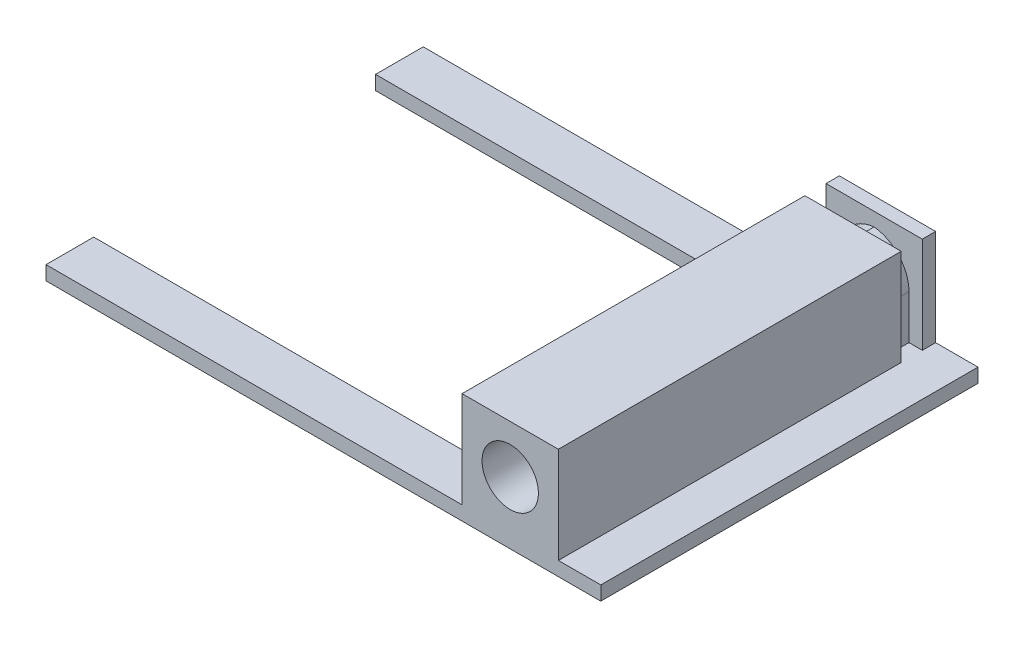
ISO-10303-21;
HEADER;
FILE_DESCRIPTION(('STEP AP214'),'2;1');
FILE_NAME('part.step','',(''),(''),'','','');
FILE_SCHEMA(('AUTOMOTIVE_DESIGN { 1 0 10303 214 1 1 1 1 }'));
ENDSEC;
DATA;
#1=APPLICATION_CONTEXT('core data for automotive mechanical design processes');
#2=APPLICATION_PROTOCOL_DEFINITION('international standard','automotive_design',2000,#1);
#3=PRODUCT_CONTEXT('',#1,'mechanical');
#4=PRODUCT('Part','Part','',(#3));
#5=PRODUCT_RELATED_PRODUCT_CATEGORY('part','',(#4));
#6=PRODUCT_DEFINITION_FORMATION('','',#4);
#7=PRODUCT_DEFINITION_CONTEXT('part definition',#1,'design');
#8=PRODUCT_DEFINITION('design','',#6,#7);
#9=PRODUCT_DEFINITION_SHAPE('','',#8);
#10=(LENGTH_UNIT() NAMED_UNIT(*) SI_UNIT(.MILLI.,.METRE.));
#11=(NAMED_UNIT(*) PLANE_ANGLE_UNIT() SI_UNIT($,.RADIAN.));
#12=(NAMED_UNIT(*) SI_UNIT($,.STERADIAN.) SOLID_ANGLE_UNIT());
#13=UNCERTAINTY_MEASURE_WITH_UNIT(LENGTH_MEASURE(1.E-05),#10,'distance_accuracy_value','');
#14=(GEOMETRIC_REPRESENTATION_CONTEXT(3) GLOBAL_UNCERTAINTY_ASSIGNED_CONTEXT((#13)) GLOBAL_UNIT_ASSIGNED_CONTEXT((#10,
#11,#12)) REPRESENTATION_CONTEXT('',''));
#15=CARTESIAN_POINT('',(0.,0.,0.));
#16=DIRECTION('',(0.,0.,1.));
#17=DIRECTION('',(1.,0.,0.));
#18=AXIS2_PLACEMENT_3D('',#15,#16,#17);
#19=CARTESIAN_POINT('',(94.053788038545,12.7,-196.825353899226));
#20=DIRECTION('',(1.,0.,0.));
#21=DIRECTION('',(0.,0.,-1.));
#22=AXIS2_PLACEMENT_3D('',#19,#20,#21);
#23=PLANE('',#22);
#24=DIRECTION('',(0.,1.,0.));
#25=VECTOR('',#24,1.);
#26=CARTESIAN_POINT('',(94.053788038545,87.5,-184.825353899226));
#27=LINE('',#26,#25);
#28=CARTESIAN_POINT('',(94.053788038545,12.7,-184.825353899226));
#29=VERTEX_POINT('',#28);
#30=CARTESIAN_POINT('',(94.053788038545,99.5,-184.825353899226));
#31=VERTEX_POINT('',#30);
#32=EDGE_CURVE('E238',#29,#31,#27,.T.);
#33=ORIENTED_EDGE('',*,*,#32,.F.);
#34=DIRECTION('',(0.,0.,1.));
#35=VECTOR('',#34,1.);
#36=CARTESIAN_POINT('',(94.053788038545,12.7,-196.825353899226));
#37=LINE('',#36,#35);
#38=CARTESIAN_POINT('',(94.053788038545,12.7,-196.825353899226));
#39=VERTEX_POINT('',#38);
#40=EDGE_CURVE('E293',#39,#29,#37,.T.);
#41=ORIENTED_EDGE('',*,*,#40,.F.);
#42=DIRECTION('',(0.,1.,0.));
#43=VECTOR('',#42,1.);
#44=CARTESIAN_POINT('',(94.053788038545,12.7,-196.825353899226));
#45=LINE('',#44,#43);
#46=CARTESIAN_POINT('',(94.053788038545,99.5000000000001,-196.825353899226));
#47=VERTEX_POINT('',#46);
#48=EDGE_CURVE('E262',#39,#47,#45,.T.);
#49=ORIENTED_EDGE('',*,*,#48,.T.);
#50=DIRECTION('',(0.,0.,1.));
#51=VECTOR('',#50,1.);
#52=CARTESIAN_POINT('',(94.053788038545,99.5000000000001,-196.825353899226));
#53=LINE('',#52,#51);
#54=EDGE_CURVE('E288',#47,#31,#53,.T.);
#55=ORIENTED_EDGE('',*,*,#54,.T.);
#56=EDGE_LOOP('',(#33,#41,#49,#55));
#57=FACE_BOUND('',#56,.T.);
#58=ADVANCED_FACE('F39',(#57),#23,.T.);
#59=CARTESIAN_POINT('',(7.253788038545,12.7,-153.825353899226));
#60=DIRECTION('',(1.,0.,0.));
#61=DIRECTION('',(0.,0.,-1.));
#62=AXIS2_PLACEMENT_3D('',#59,#60,#61);
#63=PLANE('',#62);
#64=DIRECTION('',(0.,1.,0.));
#65=VECTOR('',#64,1.);
#66=CARTESIAN_POINT('',(7.25378803854504,87.5,-165.825353899226));
#67=LINE('',#66,#65);
#68=CARTESIAN_POINT('',(7.25378803854499,12.7,-165.825353899226));
#69=VERTEX_POINT('',#68);
#70=CARTESIAN_POINT('',(7.25378803854504,99.5,-165.825353899226));
#71=VERTEX_POINT('',#70);
#72=EDGE_CURVE('E242',#69,#71,#67,.T.);
#73=ORIENTED_EDGE('',*,*,#72,.F.);
#74=DIRECTION('',(0.,0.,1.));
#75=VECTOR('',#74,1.);
#76=CARTESIAN_POINT('',(7.25378803854504,12.7,-196.825353899226));
#77=LINE('',#76,#75);
#78=CARTESIAN_POINT('',(7.25378803854504,12.7,-153.825353899226));
#79=VERTEX_POINT('',#78);
#80=EDGE_CURVE('E271',#69,#79,#77,.T.);
#81=ORIENTED_EDGE('',*,*,#80,.T.);
#82=DIRECTION('',(0.,-1.,0.));
#83=VECTOR('',#82,1.);
#84=CARTESIAN_POINT('',(7.253788038545,12.7,-153.825353899226));
#85=LINE('',#84,#83);
#86=CARTESIAN_POINT('',(7.253788038545,0.,-153.825353899226));
#87=VERTEX_POINT('',#86);
#88=EDGE_CURVE('E331',#79,#87,#85,.T.);
#89=ORIENTED_EDGE('',*,*,#88,.T.);
#90=DIRECTION('',(0.,0.,1.));
#91=VECTOR('',#90,1.);
#92=CARTESIAN_POINT('',(7.253788038545,0.,-153.825353899226));
#93=LINE('',#92,#91);
#94=CARTESIAN_POINT('',(7.25378803854503,0.,100.174646100774));
#95=VERTEX_POINT('',#94);
#96=EDGE_CURVE('E286',#87,#95,#93,.T.);
#97=ORIENTED_EDGE('',*,*,#96,.T.);
#98=DIRECTION('',(0.,-1.,0.));
#99=VECTOR('',#98,1.);
#100=CARTESIAN_POINT('',(7.25378803854503,12.7,100.174646100774));
#101=LINE('',#100,#99);
#102=CARTESIAN_POINT('',(7.25378803854504,12.7,100.174646100774));
#103=VERTEX_POINT('',#102);
#104=EDGE_CURVE('E382',#103,#95,#101,.T.);
#105=ORIENTED_EDGE('',*,*,#104,.F.);
#106=CARTESIAN_POINT('',(7.25378803854504,12.7,143.174646100774));
#107=VERTEX_POINT('',#106);
#108=EDGE_CURVE('E301',#103,#107,#77,.T.);
#109=ORIENTED_EDGE('',*,*,#108,.T.);
#110=DIRECTION('',(0.,-1.,0.));
#111=VECTOR('',#110,1.);
#112=CARTESIAN_POINT('',(7.25378803854504,12.7,143.174646100774));
#113=LINE('',#112,#111);
#114=CARTESIAN_POINT('',(7.25378803854504,99.5,143.174646100774));
#115=VERTEX_POINT('',#114);
#116=EDGE_CURVE('E255',#115,#107,#113,.T.);
#117=ORIENTED_EDGE('',*,*,#116,.F.);
#118=DIRECTION('',(0.,0.,1.));
#119=VECTOR('',#118,1.);
#120=CARTESIAN_POINT('',(7.25378803854504,99.5,-196.825353899226));
#121=LINE('',#120,#119);
#122=EDGE_CURVE('E287',#71,#115,#121,.T.);
#123=ORIENTED_EDGE('',*,*,#122,.F.);
#124=EDGE_LOOP('',(#73,#81,#89,#97,#105,#109,#117,#123));
#125=FACE_BOUND('',#124,.T.);
#126=ADVANCED_FACE('F407',(#125),#63,.F.);
#127=CARTESIAN_POINT('',(7.25378803854504,99.5,-196.825353899226));
#128=DIRECTION('',(0.,1.,0.));
#129=DIRECTION('',(-1.,0.,0.));
#130=AXIS2_PLACEMENT_3D('',#127,#128,#129);
#131=PLANE('',#130);
#132=DIRECTION('',(1.,0.,0.));
#133=VECTOR('',#132,1.);
#134=CARTESIAN_POINT('',(7.25378803854504,99.5,-165.825353899226));
#135=LINE('',#134,#133);
#136=CARTESIAN_POINT('',(94.053788038545,99.5,-165.825353899226));
#137=VERTEX_POINT('',#136);
#138=EDGE_CURVE('E235',#71,#137,#135,.T.);
#139=ORIENTED_EDGE('',*,*,#138,.F.);
#140=ORIENTED_EDGE('',*,*,#122,.T.);
#141=DIRECTION('',(-1.,0.,0.));
#142=VECTOR('',#141,1.);
#143=CARTESIAN_POINT('',(7.25378803854504,99.5,143.174646100774));
#144=LINE('',#143,#142);
#145=CARTESIAN_POINT('',(94.053788038545,99.5000000000001,143.174646100774));
#146=VERTEX_POINT('',#145);
#147=EDGE_CURVE('E263',#146,#115,#144,.T.);
#148=ORIENTED_EDGE('',*,*,#147,.F.);
#149=EDGE_CURVE('E292',#137,#146,#53,.T.);
#150=ORIENTED_EDGE('',*,*,#149,.F.);
#151=EDGE_LOOP('',(#139,#140,#148,#150));
#152=FACE_BOUND('',#151,.T.);
#153=ADVANCED_FACE('F445',(#152),#131,.T.);
#154=CARTESIAN_POINT('',(0.,12.7,0.));
#155=DIRECTION('',(0.,-1.,0.));
#156=DIRECTION('',(0.,0.,-1.));
#157=AXIS2_PLACEMENT_3D('',#154,#155,#156);
#158=PLANE('',#157);
#159=CARTESIAN_POINT('',(7.25378803854504,12.7,-196.825353899226));
#160=VERTEX_POINT('',#159);
#161=CARTESIAN_POINT('',(7.25378803854499,12.7,-184.825353899226));
#162=VERTEX_POINT('',#161);
#163=EDGE_CURVE('E297',#160,#162,#77,.T.);
#164=ORIENTED_EDGE('',*,*,#163,.F.);
#165=DIRECTION('',(1.,0.,0.));
#166=VECTOR('',#165,1.);
#167=CARTESIAN_POINT('',(-367.746211961455,12.7,-196.825353899226));
#168=LINE('',#167,#166);
#169=CARTESIAN_POINT('',(-367.746211961455,12.7,-196.825353899226));
#170=VERTEX_POINT('',#169);
#171=EDGE_CURVE('E320',#170,#160,#168,.T.);
#172=ORIENTED_EDGE('',*,*,#171,.F.);
#173=DIRECTION('',(0.,0.,1.));
#174=VECTOR('',#173,1.);
#175=CARTESIAN_POINT('',(-367.746211961455,12.7,-196.825353899226));
#176=LINE('',#175,#174);
#177=CARTESIAN_POINT('',(-367.746211961455,12.7,-153.825353899226));
#178=VERTEX_POINT('',#177);
#179=EDGE_CURVE('E324',#170,#178,#176,.T.);
#180=ORIENTED_EDGE('',*,*,#179,.T.);
#181=DIRECTION('',(1.,0.,0.));
#182=VECTOR('',#181,1.);
#183=CARTESIAN_POINT('',(-367.746211961455,12.7,-153.825353899226));
#184=LINE('',#183,#182);
#185=EDGE_CURVE('E327',#178,#79,#184,.T.);
#186=ORIENTED_EDGE('',*,*,#185,.T.);
#187=ORIENTED_EDGE('',*,*,#80,.F.);
#188=DIRECTION('',(-1.,0.,0.));
#189=VECTOR('',#188,1.);
#190=CARTESIAN_POINT('',(19.253788038545,12.7,-165.825353899226));
#191=LINE('',#190,#189);
#192=CARTESIAN_POINT('',(19.253788038545,12.7,-165.825353899226));
#193=VERTEX_POINT('',#192);
#194=EDGE_CURVE('E228',#193,#69,#191,.T.);
#195=ORIENTED_EDGE('',*,*,#194,.F.);
#196=DIRECTION('',(0.,0.,1.));
#197=VECTOR('',#196,1.);
#198=CARTESIAN_POINT('',(19.253788038545,12.7,-184.825353899226));
#199=LINE('',#198,#197);
#200=CARTESIAN_POINT('',(19.253788038545,12.7,-184.825353899226));
#201=VERTEX_POINT('',#200);
#202=EDGE_CURVE('E217',#201,#193,#199,.T.);
#203=ORIENTED_EDGE('',*,*,#202,.F.);
#204=DIRECTION('',(-1.,0.,0.));
#205=VECTOR('',#204,1.);
#206=CARTESIAN_POINT('',(19.253788038545,12.7,-184.825353899226));
#207=LINE('',#206,#205);
#208=EDGE_CURVE('E224',#201,#162,#207,.T.);
#209=ORIENTED_EDGE('',*,*,#208,.T.);
#210=EDGE_LOOP('',(#164,#172,#180,#186,#187,#195,#203,#209));
#211=FACE_BOUND('',#210,.T.);
#212=ADVANCED_FACE('F415',(#211),#158,.F.);
#213=ORIENTED_EDGE('',*,*,#108,.F.);
#214=DIRECTION('',(-1.,0.,0.));
#215=VECTOR('',#214,1.);
#216=CARTESIAN_POINT('',(7.25378803854503,12.7,100.174646100774));
#217=LINE('',#216,#215);
#218=CARTESIAN_POINT('',(-367.746211961455,12.7,100.174646100774));
#219=VERTEX_POINT('',#218);
#220=EDGE_CURVE('E302',#103,#219,#217,.T.);
#221=ORIENTED_EDGE('',*,*,#220,.T.);
#222=DIRECTION('',(0.,0.,1.));
#223=VECTOR('',#222,1.);
#224=CARTESIAN_POINT('',(-367.746211961455,12.7,100.174646100774));
#225=LINE('',#224,#223);
#226=CARTESIAN_POINT('',(-367.746211961455,12.7,143.174646100774));
#227=VERTEX_POINT('',#226);
#228=EDGE_CURVE('E305',#219,#227,#225,.T.);
#229=ORIENTED_EDGE('',*,*,#228,.T.);
#230=DIRECTION('',(-1.,0.,0.));
#231=VECTOR('',#230,1.);
#232=CARTESIAN_POINT('',(132.253788038545,12.7,143.174646100774));
#233=LINE('',#232,#231);
#234=EDGE_CURVE('E310',#107,#227,#233,.T.);
#235=ORIENTED_EDGE('',*,*,#234,.F.);
#236=EDGE_LOOP('',(#213,#221,#229,#235));
#237=FACE_BOUND('',#236,.T.);
#238=ADVANCED_FACE('F435',(#237),#158,.F.);
#239=ORIENTED_EDGE('',*,*,#163,.T.);
#240=DIRECTION('',(0.,1.,0.));
#241=VECTOR('',#240,1.);
#242=CARTESIAN_POINT('',(7.25378803854504,87.5,-184.825353899226));
#243=LINE('',#242,#241);
#244=CARTESIAN_POINT('',(7.25378803854504,99.5,-184.825353899226));
#245=VERTEX_POINT('',#244);
#246=EDGE_CURVE('E245',#162,#245,#243,.T.);
#247=ORIENTED_EDGE('',*,*,#246,.T.);
#248=CARTESIAN_POINT('',(7.25378803854504,99.5,-196.825353899226));
#249=VERTEX_POINT('',#248);
#250=EDGE_CURVE('E282',#249,#245,#121,.T.);
#251=ORIENTED_EDGE('',*,*,#250,.F.);
#252=DIRECTION('',(0.,-1.,0.));
#253=VECTOR('',#252,1.);
#254=CARTESIAN_POINT('',(7.25378803854504,12.7,-196.825353899226));
#255=LINE('',#254,#253);
#256=EDGE_CURVE('E259',#249,#160,#255,.T.);
#257=ORIENTED_EDGE('',*,*,#256,.T.);
#258=EDGE_LOOP('',(#239,#247,#251,#257));
#259=FACE_BOUND('',#258,.T.);
#260=ADVANCED_FACE('F485',(#259),#63,.F.);
#261=CARTESIAN_POINT('',(7.25378803854503,12.7,100.174646100774));
#262=DIRECTION('',(0.,0.,1.));
#263=DIRECTION('',(1.,0.,0.));
#264=AXIS2_PLACEMENT_3D('',#261,#262,#263);
#265=PLANE('',#264);
#266=DIRECTION('',(-1.,0.,0.));
#267=VECTOR('',#266,1.);
#268=CARTESIAN_POINT('',(7.25378803854503,0.,100.174646100774));
#269=LINE('',#268,#267);
#270=CARTESIAN_POINT('',(-367.746211961455,0.,100.174646100774));
#271=VERTEX_POINT('',#270);
#272=EDGE_CURVE('E335',#95,#271,#269,.T.);
#273=ORIENTED_EDGE('',*,*,#272,.T.);
#274=DIRECTION('',(0.,-1.,0.));
#275=VECTOR('',#274,1.);
#276=CARTESIAN_POINT('',(-367.746211961455,12.7,100.174646100774));
#277=LINE('',#276,#275);
#278=EDGE_CURVE('E378',#219,#271,#277,.T.);
#279=ORIENTED_EDGE('',*,*,#278,.F.);
#280=ORIENTED_EDGE('',*,*,#220,.F.);
#281=ORIENTED_EDGE('',*,*,#104,.T.);
#282=EDGE_LOOP('',(#273,#279,#280,#281));
#283=FACE_BOUND('',#282,.T.);
#284=ADVANCED_FACE('F431',(#283),#265,.F.);
#285=CARTESIAN_POINT('',(-367.746211961455,12.7,100.174646100774));
#286=DIRECTION('',(1.,0.,0.));
#287=DIRECTION('',(0.,0.,-1.));
#288=AXIS2_PLACEMENT_3D('',#285,#286,#287);
#289=PLANE('',#288);
#290=DIRECTION('',(0.,0.,1.));
#291=VECTOR('',#290,1.);
#292=CARTESIAN_POINT('',(-367.746211961455,0.,100.174646100774));
#293=LINE('',#292,#291);
#294=CARTESIAN_POINT('',(-367.746211961455,0.,143.174646100774));
#295=VERTEX_POINT('',#294);
#296=EDGE_CURVE('E338',#271,#295,#293,.T.);
#297=ORIENTED_EDGE('',*,*,#296,.T.);
#298=DIRECTION('',(0.,-1.,0.));
#299=VECTOR('',#298,1.);
#300=CARTESIAN_POINT('',(-367.746211961455,12.7,143.174646100774));
#301=LINE('',#300,#299);
#302=EDGE_CURVE('E375',#227,#295,#301,.T.);
#303=ORIENTED_EDGE('',*,*,#302,.F.);
#304=ORIENTED_EDGE('',*,*,#228,.F.);
#305=ORIENTED_EDGE('',*,*,#278,.T.);
#306=EDGE_LOOP('',(#297,#303,#304,#305));
#307=FACE_BOUND('',#306,.T.);
#308=ADVANCED_FACE('F527',(#307),#289,.F.);
#309=CARTESIAN_POINT('',(132.253788038545,12.7,143.174646100774));
#310=DIRECTION('',(0.,0.,1.));
#311=DIRECTION('',(1.,0.,0.));
#312=AXIS2_PLACEMENT_3D('',#309,#310,#311);
#313=PLANE('',#312);
#314=DIRECTION('',(-1.,0.,0.));
#315=VECTOR('',#314,1.);
#316=CARTESIAN_POINT('',(132.253788038545,0.,143.174646100774));
#317=LINE('',#316,#315);
#318=CARTESIAN_POINT('',(132.253788038545,0.,143.174646100774));
#319=VERTEX_POINT('',#318);
#320=EDGE_CURVE('E342',#319,#295,#317,.T.);
#321=ORIENTED_EDGE('',*,*,#320,.F.);
#322=DIRECTION('',(0.,-1.,0.));
#323=VECTOR('',#322,1.);
#324=CARTESIAN_POINT('',(132.253788038545,12.7,143.174646100774));
#325=LINE('',#324,#323);
#326=CARTESIAN_POINT('',(132.253788038545,12.7,143.174646100774));
#327=VERTEX_POINT('',#326);
#328=EDGE_CURVE('E372',#327,#319,#325,.T.);
#329=ORIENTED_EDGE('',*,*,#328,.F.);
#330=CARTESIAN_POINT('',(94.053788038545,12.7,143.174646100774));
#331=VERTEX_POINT('',#330);
#332=EDGE_CURVE('E311',#327,#331,#233,.T.);
#333=ORIENTED_EDGE('',*,*,#332,.T.);
#334=DIRECTION('',(0.,1.,0.));
#335=VECTOR('',#334,1.);
#336=CARTESIAN_POINT('',(94.053788038545,12.7,143.174646100774));
#337=LINE('',#336,#335);
#338=EDGE_CURVE('E275',#331,#146,#337,.T.);
#339=ORIENTED_EDGE('',*,*,#338,.T.);
#340=ORIENTED_EDGE('',*,*,#147,.T.);
#341=ORIENTED_EDGE('',*,*,#116,.T.);
#342=ORIENTED_EDGE('',*,*,#234,.T.);
#343=ORIENTED_EDGE('',*,*,#302,.T.);
#344=EDGE_LOOP('',(#321,#329,#333,#339,#340,#341,#342,#343));
#345=FACE_BOUND('',#344,.T.);
#346=CARTESIAN_POINT('',(50.653788038545,56.1000000000001,143.174646100774));
#347=DIRECTION('',(0.,0.,1.));
#348=DIRECTION('',(1.,0.,0.));
#349=AXIS2_PLACEMENT_3D('',#346,#347,#348);
#350=CIRCLE('',#349,25.4);
#351=CARTESIAN_POINT('',(76.053788038545,56.1000000000001,143.174646100774));
#352=VERTEX_POINT('',#351);
#353=EDGE_CURVE('E241',#352,#352,#350,.T.);
#354=ORIENTED_EDGE('',*,*,#353,.F.);
#355=EDGE_LOOP('',(#354));
#356=FACE_BOUND('',#355,.T.);
#357=ADVANCED_FACE('F440',(#345,#356),#313,.T.);
#358=CARTESIAN_POINT('',(132.253788038545,12.7,-196.825353899226));
#359=DIRECTION('',(1.,0.,0.));
#360=DIRECTION('',(0.,0.,-1.));
#361=AXIS2_PLACEMENT_3D('',#358,#359,#360);
#362=PLANE('',#361);
#363=DIRECTION('',(0.,0.,1.));
#364=VECTOR('',#363,1.);
#365=CARTESIAN_POINT('',(132.253788038545,0.,-196.825353899226));
#366=LINE('',#365,#364);
#367=CARTESIAN_POINT('',(132.253788038545,0.,-196.825353899226));
#368=VERTEX_POINT('',#367);
#369=EDGE_CURVE('E346',#368,#319,#366,.T.);
#370=ORIENTED_EDGE('',*,*,#369,.F.);
#371=DIRECTION('',(0.,-1.,0.));
#372=VECTOR('',#371,1.);
#373=CARTESIAN_POINT('',(132.253788038545,12.7,-196.825353899226));
#374=LINE('',#373,#372);
#375=CARTESIAN_POINT('',(132.253788038545,12.7,-196.825353899226));
#376=VERTEX_POINT('',#375);
#377=EDGE_CURVE('E369',#376,#368,#374,.T.);
#378=ORIENTED_EDGE('',*,*,#377,.F.);
#379=DIRECTION('',(0.,0.,1.));
#380=VECTOR('',#379,1.);
#381=CARTESIAN_POINT('',(132.253788038545,12.7,-196.825353899226));
#382=LINE('',#381,#380);
#383=EDGE_CURVE('E315',#376,#327,#382,.T.);
#384=ORIENTED_EDGE('',*,*,#383,.T.);
#385=ORIENTED_EDGE('',*,*,#328,.T.);
#386=EDGE_LOOP('',(#370,#378,#384,#385));
#387=FACE_BOUND('',#386,.T.);
#388=ADVANCED_FACE('F455',(#387),#362,.T.);
#389=CARTESIAN_POINT('',(-367.746211961455,12.7,-196.825353899226));
#390=DIRECTION('',(0.,0.,-1.));
#391=DIRECTION('',(-1.,0.,0.));
#392=AXIS2_PLACEMENT_3D('',#389,#390,#391);
#393=PLANE('',#392);
#394=DIRECTION('',(1.,0.,0.));
#395=VECTOR('',#394,1.);
#396=CARTESIAN_POINT('',(-367.746211961455,0.,-196.825353899226));
#397=LINE('',#396,#395);
#398=CARTESIAN_POINT('',(-367.746211961455,0.,-196.825353899226));
#399=VERTEX_POINT('',#398);
#400=EDGE_CURVE('E350',#399,#368,#397,.T.);
#401=ORIENTED_EDGE('',*,*,#400,.F.);
#402=DIRECTION('',(0.,-1.,0.));
#403=VECTOR('',#402,1.);
#404=CARTESIAN_POINT('',(-367.746211961455,12.7,-196.825353899226));
#405=LINE('',#404,#403);
#406=EDGE_CURVE('E366',#170,#399,#405,.T.);
#407=ORIENTED_EDGE('',*,*,#406,.F.);
#408=ORIENTED_EDGE('',*,*,#171,.T.);
#409=ORIENTED_EDGE('',*,*,#256,.F.);
#410=DIRECTION('',(-1.,0.,0.));
#411=VECTOR('',#410,1.);
#412=CARTESIAN_POINT('',(7.25378803854504,99.5,-196.825353899226));
#413=LINE('',#412,#411);
#414=EDGE_CURVE('E267',#47,#249,#413,.T.);
#415=ORIENTED_EDGE('',*,*,#414,.F.);
#416=ORIENTED_EDGE('',*,*,#48,.F.);
#417=EDGE_CURVE('E319',#39,#376,#168,.T.);
#418=ORIENTED_EDGE('',*,*,#417,.T.);
#419=ORIENTED_EDGE('',*,*,#377,.T.);
#420=EDGE_LOOP('',(#401,#407,#408,#409,#415,#416,#418,#419));
#421=FACE_BOUND('',#420,.T.);
#422=CARTESIAN_POINT('',(50.653788038545,56.1000000000001,-196.825353899226));
#423=DIRECTION('',(0.,0.,1.));
#424=DIRECTION('',(1.,0.,0.));
#425=AXIS2_PLACEMENT_3D('',#422,#423,#424);
#426=CIRCLE('',#425,25.4);
#427=CARTESIAN_POINT('',(76.053788038545,56.1000000000001,-196.825353899226));
#428=VERTEX_POINT('',#427);
#429=EDGE_CURVE('E251',#428,#428,#426,.T.);
#430=ORIENTED_EDGE('',*,*,#429,.T.);
#431=EDGE_LOOP('',(#430));
#432=FACE_BOUND('',#431,.T.);
#433=ADVANCED_FACE('F457',(#421,#432),#393,.T.);
#434=CARTESIAN_POINT('',(-367.746211961455,12.7,-196.825353899226));
#435=DIRECTION('',(1.,0.,0.));
#436=DIRECTION('',(0.,0.,-1.));
#437=AXIS2_PLACEMENT_3D('',#434,#435,#436);
#438=PLANE('',#437);
#439=DIRECTION('',(0.,0.,1.));
#440=VECTOR('',#439,1.);
#441=CARTESIAN_POINT('',(-367.746211961455,0.,-196.825353899226));
#442=LINE('',#441,#440);
#443=CARTESIAN_POINT('',(-367.746211961455,0.,-153.825353899226));
#444=VERTEX_POINT('',#443);
#445=EDGE_CURVE('E354',#399,#444,#442,.T.);
#446=ORIENTED_EDGE('',*,*,#445,.T.);
#447=DIRECTION('',(0.,-1.,0.));
#448=VECTOR('',#447,1.);
#449=CARTESIAN_POINT('',(-367.746211961455,12.7,-153.825353899226));
#450=LINE('',#449,#448);
#451=EDGE_CURVE('E362',#178,#444,#450,.T.);
#452=ORIENTED_EDGE('',*,*,#451,.F.);
#453=ORIENTED_EDGE('',*,*,#179,.F.);
#454=ORIENTED_EDGE('',*,*,#406,.T.);
#455=EDGE_LOOP('',(#446,#452,#453,#454));
#456=FACE_BOUND('',#455,.T.);
#457=ADVANCED_FACE('F513',(#456),#438,.F.);
#458=CARTESIAN_POINT('',(-367.746211961455,12.7,-153.825353899226));
#459=DIRECTION('',(0.,0.,-1.));
#460=DIRECTION('',(-1.,0.,0.));
#461=AXIS2_PLACEMENT_3D('',#458,#459,#460);
#462=PLANE('',#461);
#463=DIRECTION('',(1.,0.,0.));
#464=VECTOR('',#463,1.);
#465=CARTESIAN_POINT('',(-367.746211961455,0.,-153.825353899226));
#466=LINE('',#465,#464);
#467=EDGE_CURVE('E306',#444,#87,#466,.T.);
#468=ORIENTED_EDGE('',*,*,#467,.T.);
#469=ORIENTED_EDGE('',*,*,#88,.F.);
#470=ORIENTED_EDGE('',*,*,#185,.F.);
#471=ORIENTED_EDGE('',*,*,#451,.T.);
#472=EDGE_LOOP('',(#468,#469,#470,#471));
#473=FACE_BOUND('',#472,.T.);
#474=ADVANCED_FACE('F420',(#473),#462,.F.);
#475=ORIENTED_EDGE('',*,*,#417,.F.);
#476=ORIENTED_EDGE('',*,*,#40,.T.);
#477=DIRECTION('',(1.,0.,0.));
#478=VECTOR('',#477,1.);
#479=CARTESIAN_POINT('',(82.053788038545,12.7,-184.825353899226));
#480=LINE('',#479,#478);
#481=CARTESIAN_POINT('',(82.053788038545,12.7,-184.825353899226));
#482=VERTEX_POINT('',#481);
#483=EDGE_CURVE('E201',#482,#29,#480,.T.);
#484=ORIENTED_EDGE('',*,*,#483,.F.);
#485=DIRECTION('',(0.,0.,-1.));
#486=VECTOR('',#485,1.);
#487=CARTESIAN_POINT('',(82.053788038545,12.7,-165.825353899226));
#488=LINE('',#487,#486);
#489=CARTESIAN_POINT('',(82.053788038545,12.7,-165.825353899226));
#490=VERTEX_POINT('',#489);
#491=EDGE_CURVE('E187',#490,#482,#488,.T.);
#492=ORIENTED_EDGE('',*,*,#491,.F.);
#493=DIRECTION('',(1.,0.,0.));
#494=VECTOR('',#493,1.);
#495=CARTESIAN_POINT('',(82.053788038545,12.7,-165.825353899226));
#496=LINE('',#495,#494);
#497=CARTESIAN_POINT('',(94.053788038545,12.7,-165.825353899226));
#498=VERTEX_POINT('',#497);
#499=EDGE_CURVE('E194',#490,#498,#496,.T.);
#500=ORIENTED_EDGE('',*,*,#499,.T.);
#501=EDGE_CURVE('E296',#498,#331,#37,.T.);
#502=ORIENTED_EDGE('',*,*,#501,.T.);
#503=ORIENTED_EDGE('',*,*,#332,.F.);
#504=ORIENTED_EDGE('',*,*,#383,.F.);
#505=EDGE_LOOP('',(#475,#476,#484,#492,#500,#502,#503,#504));
#506=FACE_BOUND('',#505,.T.);
#507=ADVANCED_FACE('F204',(#506),#158,.F.);
#508=CARTESIAN_POINT('',(0.,0.,0.));
#509=DIRECTION('',(0.,-1.,0.));
#510=DIRECTION('',(0.,0.,-1.));
#511=AXIS2_PLACEMENT_3D('',#508,#509,#510);
#512=PLANE('',#511);
#513=ORIENTED_EDGE('',*,*,#96,.F.);
#514=ORIENTED_EDGE('',*,*,#467,.F.);
#515=ORIENTED_EDGE('',*,*,#445,.F.);
#516=ORIENTED_EDGE('',*,*,#400,.T.);
#517=ORIENTED_EDGE('',*,*,#369,.T.);
#518=ORIENTED_EDGE('',*,*,#320,.T.);
#519=ORIENTED_EDGE('',*,*,#296,.F.);
#520=ORIENTED_EDGE('',*,*,#272,.F.);
#521=EDGE_LOOP('',(#513,#514,#515,#516,#517,#518,#519,#520));
#522=FACE_BOUND('',#521,.T.);
#523=ADVANCED_FACE('F424',(#522),#512,.T.);
#524=DIRECTION('',(-1.,0.,0.));
#525=VECTOR('',#524,1.);
#526=CARTESIAN_POINT('',(7.25378803854504,99.5,-184.825353899226));
#527=LINE('',#526,#525);
#528=EDGE_CURVE('E232',#31,#245,#527,.T.);
#529=ORIENTED_EDGE('',*,*,#528,.F.);
#530=ORIENTED_EDGE('',*,*,#54,.F.);
#531=ORIENTED_EDGE('',*,*,#414,.T.);
#532=ORIENTED_EDGE('',*,*,#250,.T.);
#533=EDGE_LOOP('',(#529,#530,#531,#532));
#534=FACE_BOUND('',#533,.T.);
#535=ADVANCED_FACE('F490',(#534),#131,.T.);
#536=ORIENTED_EDGE('',*,*,#501,.F.);
#537=DIRECTION('',(0.,1.,0.));
#538=VECTOR('',#537,1.);
#539=CARTESIAN_POINT('',(94.053788038545,87.5,-165.825353899226));
#540=LINE('',#539,#538);
#541=EDGE_CURVE('E197',#498,#137,#540,.T.);
#542=ORIENTED_EDGE('',*,*,#541,.T.);
#543=ORIENTED_EDGE('',*,*,#149,.T.);
#544=ORIENTED_EDGE('',*,*,#338,.F.);
#545=EDGE_LOOP('',(#536,#542,#543,#544));
#546=FACE_BOUND('',#545,.T.);
#547=ADVANCED_FACE('F448',(#546),#23,.T.);
#548=CARTESIAN_POINT('',(50.653788038545,56.1000000000001,-196.825353899226));
#549=DIRECTION('',(0.,0.,1.));
#550=DIRECTION('',(1.,0.,0.));
#551=AXIS2_PLACEMENT_3D('',#548,#549,#550);
#552=CYLINDRICAL_SURFACE('',#551,25.4);
#553=ORIENTED_EDGE('',*,*,#429,.F.);
#554=EDGE_LOOP('',(#553));
#555=FACE_BOUND('',#554,.T.);
#556=ORIENTED_EDGE('',*,*,#353,.T.);
#557=EDGE_LOOP('',(#556));
#558=FACE_BOUND('',#557,.T.);
#559=ADVANCED_FACE('F489',(#555,#558),#552,.F.);
#560=CARTESIAN_POINT('',(7.25378803854504,87.5,-165.825353899226));
#561=DIRECTION('',(0.,0.,1.));
#562=DIRECTION('',(1.,0.,0.));
#563=AXIS2_PLACEMENT_3D('',#560,#561,#562);
#564=PLANE('',#563);
#565=ORIENTED_EDGE('',*,*,#138,.T.);
#566=ORIENTED_EDGE('',*,*,#541,.F.);
#567=ORIENTED_EDGE('',*,*,#499,.F.);
#568=DIRECTION('',(0.,-1.,0.));
#569=VECTOR('',#568,1.);
#570=CARTESIAN_POINT('',(82.053788038545,87.5,-165.825353899226));
#571=LINE('',#570,#569);
#572=CARTESIAN_POINT('',(82.053788038545,52.5,-165.825353899226));
#573=VERTEX_POINT('',#572);
#574=EDGE_CURVE('E182',#573,#490,#571,.T.);
#575=ORIENTED_EDGE('',*,*,#574,.F.);
#576=CARTESIAN_POINT('',(47.053788038545,52.5,-165.825353899226));
#577=DIRECTION('',(0.,0.,1.));
#578=DIRECTION('',(1.,0.,0.));
#579=AXIS2_PLACEMENT_3D('',#576,#577,#578);
#580=CIRCLE('',#579,35.);
#581=CARTESIAN_POINT('',(50.653788038545,87.3143648513081,-165.825353899226));
#582=VERTEX_POINT('',#581);
#583=EDGE_CURVE('E49',#573,#582,#580,.T.);
#584=ORIENTED_EDGE('',*,*,#583,.T.);
#585=CARTESIAN_POINT('',(54.253788038545,52.5,-165.825353899226));
#586=DIRECTION('',(0.,0.,1.));
#587=DIRECTION('',(1.,0.,0.));
#588=AXIS2_PLACEMENT_3D('',#585,#586,#587);
#589=CIRCLE('',#588,35.);
#590=CARTESIAN_POINT('',(19.253788038545,52.5,-165.825353899226));
#591=VERTEX_POINT('',#590);
#592=EDGE_CURVE('E392',#582,#591,#589,.T.);
#593=ORIENTED_EDGE('',*,*,#592,.T.);
#594=DIRECTION('',(0.,-1.,0.));
#595=VECTOR('',#594,1.);
#596=CARTESIAN_POINT('',(19.253788038545,87.5,-165.825353899226));
#597=LINE('',#596,#595);
#598=EDGE_CURVE('E213',#591,#193,#597,.T.);
#599=ORIENTED_EDGE('',*,*,#598,.T.);
#600=ORIENTED_EDGE('',*,*,#194,.T.);
#601=ORIENTED_EDGE('',*,*,#72,.T.);
#602=EDGE_LOOP('',(#565,#566,#567,#575,#584,#593,#599,#600,#601));
#603=FACE_BOUND('',#602,.T.);
#604=ADVANCED_FACE('F195',(#603),#564,.F.);
#605=CARTESIAN_POINT('',(7.25378803854504,87.5,-184.825353899226));
#606=DIRECTION('',(0.,0.,-1.));
#607=DIRECTION('',(-1.,0.,0.));
#608=AXIS2_PLACEMENT_3D('',#605,#606,#607);
#609=PLANE('',#608);
#610=ORIENTED_EDGE('',*,*,#528,.T.);
#611=ORIENTED_EDGE('',*,*,#246,.F.);
#612=ORIENTED_EDGE('',*,*,#208,.F.);
#613=DIRECTION('',(0.,-1.,0.));
#614=VECTOR('',#613,1.);
#615=CARTESIAN_POINT('',(19.253788038545,87.5,-184.825353899226));
#616=LINE('',#615,#614);
#617=CARTESIAN_POINT('',(19.253788038545,52.5,-184.825353899226));
#618=VERTEX_POINT('',#617);
#619=EDGE_CURVE('E221',#618,#201,#616,.T.);
#620=ORIENTED_EDGE('',*,*,#619,.F.);
#621=CARTESIAN_POINT('',(54.253788038545,52.5,-184.825353899226));
#622=DIRECTION('',(0.,0.,-1.));
#623=DIRECTION('',(-1.,0.,0.));
#624=AXIS2_PLACEMENT_3D('',#621,#622,#623);
#625=CIRCLE('',#624,35.);
#626=CARTESIAN_POINT('',(50.653788038545,87.3143648513081,-184.825353899226));
#627=VERTEX_POINT('',#626);
#628=EDGE_CURVE('E55',#618,#627,#625,.T.);
#629=ORIENTED_EDGE('',*,*,#628,.T.);
#630=CARTESIAN_POINT('',(47.053788038545,52.5,-184.825353899226));
#631=DIRECTION('',(0.,0.,-1.));
#632=DIRECTION('',(-1.,0.,0.));
#633=AXIS2_PLACEMENT_3D('',#630,#631,#632);
#634=CIRCLE('',#633,35.);
#635=CARTESIAN_POINT('',(82.053788038545,52.5,-184.825353899226));
#636=VERTEX_POINT('',#635);
#637=EDGE_CURVE('E11',#627,#636,#634,.T.);
#638=ORIENTED_EDGE('',*,*,#637,.T.);
#639=DIRECTION('',(0.,1.,0.));
#640=VECTOR('',#639,1.);
#641=CARTESIAN_POINT('',(82.053788038545,87.5,-184.825353899226));
#642=LINE('',#641,#640);
#643=EDGE_CURVE('E191',#482,#636,#642,.T.);
#644=ORIENTED_EDGE('',*,*,#643,.F.);
#645=ORIENTED_EDGE('',*,*,#483,.T.);
#646=ORIENTED_EDGE('',*,*,#32,.T.);
#647=EDGE_LOOP('',(#610,#611,#612,#620,#629,#638,#644,#645,#646));
#648=FACE_BOUND('',#647,.T.);
#649=ADVANCED_FACE('F463',(#648),#609,.F.);
#650=CARTESIAN_POINT('',(19.253788038545,0.,0.));
#651=DIRECTION('',(1.,0.,0.));
#652=DIRECTION('',(0.,0.,-1.));
#653=AXIS2_PLACEMENT_3D('',#650,#651,#652);
#654=PLANE('',#653);
#655=ORIENTED_EDGE('',*,*,#598,.F.);
#656=DIRECTION('',(0.,0.,1.));
#657=VECTOR('',#656,1.);
#658=CARTESIAN_POINT('',(19.253788038545,52.5,-184.825353899226));
#659=LINE('',#658,#657);
#660=EDGE_CURVE('E386',#591,#618,#659,.F.);
#661=ORIENTED_EDGE('',*,*,#660,.T.);
#662=ORIENTED_EDGE('',*,*,#619,.T.);
#663=ORIENTED_EDGE('',*,*,#202,.T.);
#664=EDGE_LOOP('',(#655,#661,#662,#663));
#665=FACE_BOUND('',#664,.T.);
#666=ADVANCED_FACE('F477',(#665),#654,.F.);
#667=CARTESIAN_POINT('',(82.053788038545,0.,0.));
#668=DIRECTION('',(1.,0.,0.));
#669=DIRECTION('',(0.,0.,-1.));
#670=AXIS2_PLACEMENT_3D('',#667,#668,#669);
#671=PLANE('',#670);
#672=ORIENTED_EDGE('',*,*,#643,.T.);
#673=DIRECTION('',(0.,0.,1.));
#674=VECTOR('',#673,1.);
#675=CARTESIAN_POINT('',(82.053788038545,52.5,0.));
#676=LINE('',#675,#674);
#677=EDGE_CURVE('E189',#636,#573,#676,.T.);
#678=ORIENTED_EDGE('',*,*,#677,.T.);
#679=ORIENTED_EDGE('',*,*,#574,.T.);
#680=ORIENTED_EDGE('',*,*,#491,.T.);
#681=EDGE_LOOP('',(#672,#678,#679,#680));
#682=FACE_BOUND('',#681,.T.);
#683=ADVANCED_FACE('F185',(#682),#671,.T.);
#684=CARTESIAN_POINT('',(47.053788038545,52.5,0.));
#685=DIRECTION('',(0.,0.,1.));
#686=DIRECTION('',(1.,0.,0.));
#687=AXIS2_PLACEMENT_3D('',#684,#685,#686);
#688=CYLINDRICAL_SURFACE('',#687,35.);
#689=ORIENTED_EDGE('',*,*,#677,.F.);
#690=ORIENTED_EDGE('',*,*,#637,.F.);
#691=DIRECTION('',(0.,0.,1.));
#692=VECTOR('',#691,1.);
#693=CARTESIAN_POINT('',(50.653788038545,87.3143648513081,-175.325353899226));
#694=LINE('',#693,#692);
#695=EDGE_CURVE('E43',#582,#627,#694,.F.);
#696=ORIENTED_EDGE('',*,*,#695,.F.);
#697=ORIENTED_EDGE('',*,*,#583,.F.);
#698=EDGE_LOOP('',(#689,#690,#696,#697));
#699=FACE_BOUND('',#698,.T.);
#700=ADVANCED_FACE('F41',(#699),#688,.T.);
#701=CARTESIAN_POINT('',(54.253788038545,52.5,0.));
#702=DIRECTION('',(0.,0.,-1.));
#703=DIRECTION('',(-1.,0.,0.));
#704=AXIS2_PLACEMENT_3D('',#701,#702,#703);
#705=CYLINDRICAL_SURFACE('',#704,35.);
#706=ORIENTED_EDGE('',*,*,#628,.F.);
#707=ORIENTED_EDGE('',*,*,#660,.F.);
#708=ORIENTED_EDGE('',*,*,#592,.F.);
#709=ORIENTED_EDGE('',*,*,#695,.T.);
#710=EDGE_LOOP('',(#706,#707,#708,#709));
#711=FACE_BOUND('',#710,.T.);
#712=ADVANCED_FACE('F469',(#711),#705,.T.);
#713=CLOSED_SHELL('',(#58,#126,#153,#212,#238,#260,#284,#308,#357,#388,#433,#457,#474,#507,#523,
#535,#547,#559,#604,#649,#666,#683,#700,#712));
#714=MANIFOLD_SOLID_BREP('B2',#713);
#715=ADVANCED_BREP_SHAPE_REPRESENTATION('',(#18,#714),#14);
#716=SHAPE_DEFINITION_REPRESENTATION(#9,#715);
ENDSEC;
END-ISO-10303-21;
